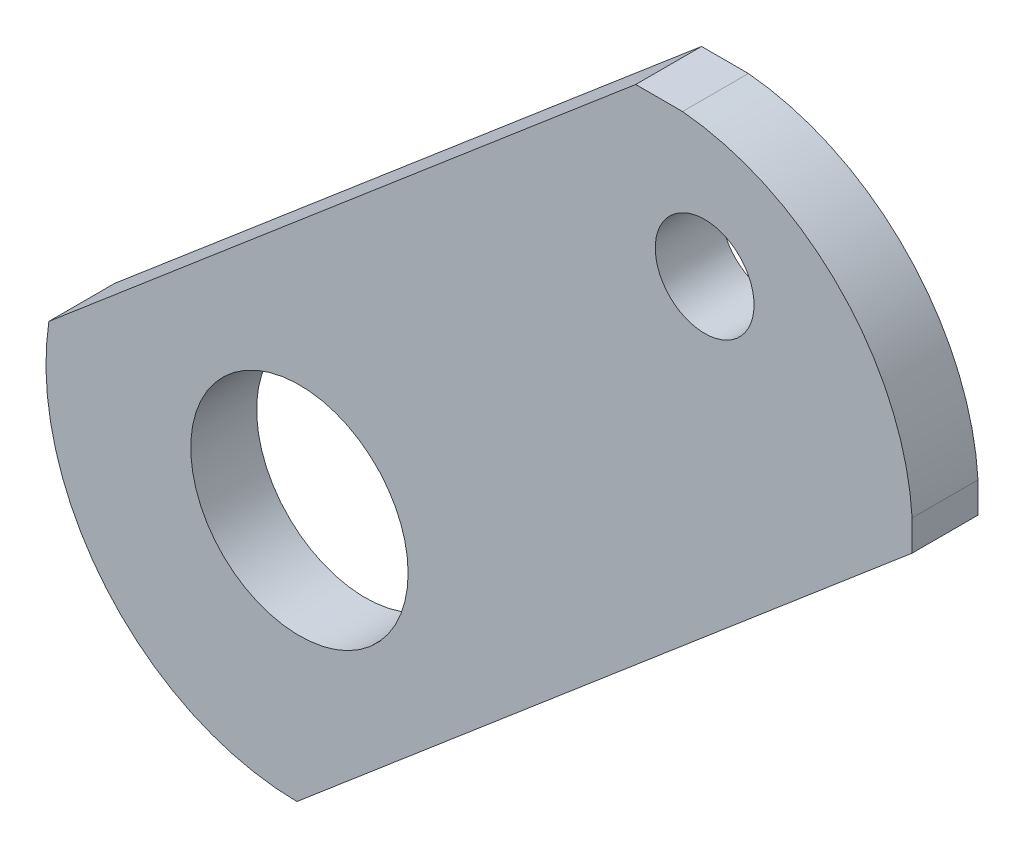
ISO-10303-21;
HEADER;
FILE_DESCRIPTION(('STEP AP214'),'2;1');
FILE_NAME('part.step','',(''),(''),'','','');
FILE_SCHEMA(('AUTOMOTIVE_DESIGN { 1 0 10303 214 1 1 1 1 }'));
ENDSEC;
DATA;
#1=APPLICATION_CONTEXT('core data for automotive mechanical design processes');
#2=APPLICATION_PROTOCOL_DEFINITION('international standard','automotive_design',2000,#1);
#3=PRODUCT_CONTEXT('',#1,'mechanical');
#4=PRODUCT('Part','Part','',(#3));
#5=PRODUCT_RELATED_PRODUCT_CATEGORY('part','',(#4));
#6=PRODUCT_DEFINITION_FORMATION('','',#4);
#7=PRODUCT_DEFINITION_CONTEXT('part definition',#1,'design');
#8=PRODUCT_DEFINITION('design','',#6,#7);
#9=PRODUCT_DEFINITION_SHAPE('','',#8);
#10=(LENGTH_UNIT() NAMED_UNIT(*) SI_UNIT(.MILLI.,.METRE.));
#11=(NAMED_UNIT(*) PLANE_ANGLE_UNIT() SI_UNIT($,.RADIAN.));
#12=(NAMED_UNIT(*) SI_UNIT($,.STERADIAN.) SOLID_ANGLE_UNIT());
#13=UNCERTAINTY_MEASURE_WITH_UNIT(LENGTH_MEASURE(1.E-05),#10,'distance_accuracy_value','');
#14=(GEOMETRIC_REPRESENTATION_CONTEXT(3) GLOBAL_UNCERTAINTY_ASSIGNED_CONTEXT((#13)) GLOBAL_UNIT_ASSIGNED_CONTEXT((#10,
#11,#12)) REPRESENTATION_CONTEXT('',''));
#15=CARTESIAN_POINT('',(0.,0.,0.));
#16=DIRECTION('',(0.,0.,1.));
#17=DIRECTION('',(1.,0.,0.));
#18=AXIS2_PLACEMENT_3D('',#15,#16,#17);
#19=CARTESIAN_POINT('',(0.,0.,2.54));
#20=DIRECTION('',(0.,0.,1.));
#21=DIRECTION('',(1.,0.,0.));
#22=AXIS2_PLACEMENT_3D('',#19,#20,#21);
#23=PLANE('',#22);
#24=CARTESIAN_POINT('',(-23.6266456506603,-20.7056456506603,2.54));
#25=DIRECTION('',(0.,0.,1.));
#26=DIRECTION('',(1.,0.,0.));
#27=AXIS2_PLACEMENT_3D('',#24,#25,#26);
#28=CIRCLE('',#27,4.191);
#29=CARTESIAN_POINT('',(-19.4356456506603,-20.7056456506603,2.54));
#30=VERTEX_POINT('',#29);
#31=EDGE_CURVE('E124',#30,#30,#28,.T.);
#32=ORIENTED_EDGE('',*,*,#31,.F.);
#33=EDGE_LOOP('',(#32));
#34=FACE_BOUND('',#33,.T.);
#35=CARTESIAN_POINT('',(-8.001,-5.08,2.54));
#36=DIRECTION('',(0.,0.,1.));
#37=DIRECTION('',(1.,0.,0.));
#38=AXIS2_PLACEMENT_3D('',#35,#36,#37);
#39=CIRCLE('',#38,1.905);
#40=CARTESIAN_POINT('',(-6.096,-5.08,2.54));
#41=VERTEX_POINT('',#40);
#42=EDGE_CURVE('E119',#41,#41,#39,.T.);
#43=ORIENTED_EDGE('',*,*,#42,.F.);
#44=EDGE_LOOP('',(#43));
#45=FACE_BOUND('',#44,.T.);
#46=CARTESIAN_POINT('',(-9.75706980936468,-9.7330161311132,2.54));
#47=DIRECTION('',(0.,0.,1.));
#48=DIRECTION('',(1.,0.,0.));
#49=AXIS2_PLACEMENT_3D('',#46,#47,#48);
#50=CIRCLE('',#49,9.77486098286725);
#51=CARTESIAN_POINT('',(-8.85357424995633,0.,2.54));
#52=VERTEX_POINT('',#51);
#53=CARTESIAN_POINT('',(0.,-9.14352824356608,2.54));
#54=VERTEX_POINT('',#53);
#55=EDGE_CURVE('E95',#52,#54,#50,.F.);
#56=ORIENTED_EDGE('',*,*,#55,.F.);
#57=DIRECTION('',(-1.,0.,0.));
#58=VECTOR('',#57,1.);
#59=CARTESIAN_POINT('',(0.,0.,2.54));
#60=LINE('',#59,#58);
#61=CARTESIAN_POINT('',(-10.6605653687731,0.,2.54));
#62=VERTEX_POINT('',#61);
#63=EDGE_CURVE('E11',#52,#62,#60,.T.);
#64=ORIENTED_EDGE('',*,*,#63,.T.);
#65=DIRECTION('',(0.762093759415718,0.647466680115369,0.));
#66=VECTOR('',#65,1.);
#67=CARTESIAN_POINT('',(-10.6605653687731,0.,2.54));
#68=LINE('',#67,#66);
#69=CARTESIAN_POINT('',(-33.2886510388991,-19.2245787676247,2.54));
#70=VERTEX_POINT('',#69);
#71=EDGE_CURVE('E152',#70,#62,#68,.T.);
#72=ORIENTED_EDGE('',*,*,#71,.F.);
#73=CARTESIAN_POINT('',(-23.6266456506603,-20.7056456506603,2.54));
#74=DIRECTION('',(0.,0.,1.));
#75=DIRECTION('',(1.,0.,0.));
#76=AXIS2_PLACEMENT_3D('',#73,#74,#75);
#77=CIRCLE('',#76,9.77486097987292);
#78=CARTESIAN_POINT('',(-23.7261659396729,-30.48,2.54));
#79=VERTEX_POINT('',#78);
#80=EDGE_CURVE('E65',#70,#79,#77,.T.);
#81=ORIENTED_EDGE('',*,*,#80,.T.);
#82=DIRECTION('',(-0.762093759415718,-0.647466680115369,0.));
#83=VECTOR('',#82,1.);
#84=CARTESIAN_POINT('',(0.,-10.3225040186603,2.54));
#85=LINE('',#84,#83);
#86=CARTESIAN_POINT('',(0.,-10.3225040186603,2.54));
#87=VERTEX_POINT('',#86);
#88=EDGE_CURVE('E141',#87,#79,#85,.T.);
#89=ORIENTED_EDGE('',*,*,#88,.F.);
#90=DIRECTION('',(0.,1.,0.));
#91=VECTOR('',#90,1.);
#92=CARTESIAN_POINT('',(0.,-30.48,2.54));
#93=LINE('',#92,#91);
#94=EDGE_CURVE('E49',#87,#54,#93,.T.);
#95=ORIENTED_EDGE('',*,*,#94,.T.);
#96=EDGE_LOOP('',(#56,#64,#72,#81,#89,#95));
#97=FACE_BOUND('',#96,.T.);
#98=ADVANCED_FACE('F39',(#34,#45,#97),#23,.T.);
#99=CARTESIAN_POINT('',(0.,0.,0.));
#100=DIRECTION('',(0.,0.,1.));
#101=DIRECTION('',(1.,0.,0.));
#102=AXIS2_PLACEMENT_3D('',#99,#100,#101);
#103=PLANE('',#102);
#104=CARTESIAN_POINT('',(-23.6266456506603,-20.7056456506603,0.));
#105=DIRECTION('',(0.,0.,1.));
#106=DIRECTION('',(1.,0.,0.));
#107=AXIS2_PLACEMENT_3D('',#104,#105,#106);
#108=CIRCLE('',#107,4.191);
#109=CARTESIAN_POINT('',(-19.4356456506603,-20.7056456506603,0.));
#110=VERTEX_POINT('',#109);
#111=EDGE_CURVE('E128',#110,#110,#108,.T.);
#112=ORIENTED_EDGE('',*,*,#111,.T.);
#113=EDGE_LOOP('',(#112));
#114=FACE_BOUND('',#113,.T.);
#115=CARTESIAN_POINT('',(-8.001,-5.08,0.));
#116=DIRECTION('',(0.,0.,1.));
#117=DIRECTION('',(1.,0.,0.));
#118=AXIS2_PLACEMENT_3D('',#115,#116,#117);
#119=CIRCLE('',#118,1.905);
#120=CARTESIAN_POINT('',(-6.096,-5.08,0.));
#121=VERTEX_POINT('',#120);
#122=EDGE_CURVE('E115',#121,#121,#119,.T.);
#123=ORIENTED_EDGE('',*,*,#122,.T.);
#124=EDGE_LOOP('',(#123));
#125=FACE_BOUND('',#124,.T.);
#126=DIRECTION('',(-1.,0.,0.));
#127=VECTOR('',#126,1.);
#128=CARTESIAN_POINT('',(0.,0.,0.));
#129=LINE('',#128,#127);
#130=CARTESIAN_POINT('',(-8.85357424995632,0.,0.));
#131=VERTEX_POINT('',#130);
#132=CARTESIAN_POINT('',(-10.6605653687731,0.,0.));
#133=VERTEX_POINT('',#132);
#134=EDGE_CURVE('E43',#131,#133,#129,.T.);
#135=ORIENTED_EDGE('',*,*,#134,.F.);
#136=CARTESIAN_POINT('',(-9.75706980936468,-9.7330161311132,0.));
#137=DIRECTION('',(0.,0.,1.));
#138=DIRECTION('',(1.,0.,0.));
#139=AXIS2_PLACEMENT_3D('',#136,#137,#138);
#140=CIRCLE('',#139,9.77486098286725);
#141=CARTESIAN_POINT('',(0.,-9.14352824356608,0.));
#142=VERTEX_POINT('',#141);
#143=EDGE_CURVE('E57',#131,#142,#140,.F.);
#144=ORIENTED_EDGE('',*,*,#143,.T.);
#145=DIRECTION('',(0.,1.,0.));
#146=VECTOR('',#145,1.);
#147=CARTESIAN_POINT('',(0.,-30.48,0.));
#148=LINE('',#147,#146);
#149=CARTESIAN_POINT('',(0.,-10.3225040186603,0.));
#150=VERTEX_POINT('',#149);
#151=EDGE_CURVE('E108',#150,#142,#148,.T.);
#152=ORIENTED_EDGE('',*,*,#151,.F.);
#153=DIRECTION('',(-0.762093759415718,-0.647466680115369,0.));
#154=VECTOR('',#153,1.);
#155=CARTESIAN_POINT('',(0.,-10.3225040186603,0.));
#156=LINE('',#155,#154);
#157=CARTESIAN_POINT('',(-23.7261659396729,-30.48,0.));
#158=VERTEX_POINT('',#157);
#159=EDGE_CURVE('E138',#150,#158,#156,.T.);
#160=ORIENTED_EDGE('',*,*,#159,.T.);
#161=CARTESIAN_POINT('',(-23.6266456506603,-20.7056456506603,0.));
#162=DIRECTION('',(0.,0.,1.));
#163=DIRECTION('',(1.,0.,0.));
#164=AXIS2_PLACEMENT_3D('',#161,#162,#163);
#165=CIRCLE('',#164,9.77486097987292);
#166=CARTESIAN_POINT('',(-33.2886510388991,-19.2245787676247,0.));
#167=VERTEX_POINT('',#166);
#168=EDGE_CURVE('E161',#167,#158,#165,.T.);
#169=ORIENTED_EDGE('',*,*,#168,.F.);
#170=DIRECTION('',(0.762093759415718,0.647466680115369,0.));
#171=VECTOR('',#170,1.);
#172=CARTESIAN_POINT('',(-10.6605653687731,0.,0.));
#173=LINE('',#172,#171);
#174=EDGE_CURVE('E151',#167,#133,#173,.T.);
#175=ORIENTED_EDGE('',*,*,#174,.T.);
#176=EDGE_LOOP('',(#135,#144,#152,#160,#169,#175));
#177=FACE_BOUND('',#176,.T.);
#178=ADVANCED_FACE('F106',(#114,#125,#177),#103,.F.);
#179=CARTESIAN_POINT('',(-10.6605653687731,0.,0.));
#180=DIRECTION('',(0.647466680115369,-0.762093759415718,0.));
#181=DIRECTION('',(0.762093759415718,0.647466680115369,0.));
#182=AXIS2_PLACEMENT_3D('',#179,#180,#181);
#183=PLANE('',#182);
#184=DIRECTION('',(0.,0.,1.));
#185=VECTOR('',#184,1.);
#186=CARTESIAN_POINT('',(-33.2886510388991,-19.2245787676247,0.));
#187=LINE('',#186,#185);
#188=EDGE_CURVE('E156',#167,#70,#187,.T.);
#189=ORIENTED_EDGE('',*,*,#188,.T.);
#190=ORIENTED_EDGE('',*,*,#71,.T.);
#191=DIRECTION('',(0.,0.,1.));
#192=VECTOR('',#191,1.);
#193=CARTESIAN_POINT('',(-10.6605653687731,0.,0.));
#194=LINE('',#193,#192);
#195=EDGE_CURVE('E145',#133,#62,#194,.T.);
#196=ORIENTED_EDGE('',*,*,#195,.F.);
#197=ORIENTED_EDGE('',*,*,#174,.F.);
#198=EDGE_LOOP('',(#189,#190,#196,#197));
#199=FACE_BOUND('',#198,.T.);
#200=ADVANCED_FACE('F178',(#199),#183,.F.);
#201=CARTESIAN_POINT('',(0.,-30.48,2.54));
#202=DIRECTION('',(-1.,0.,0.));
#203=DIRECTION('',(0.,-1.,0.));
#204=AXIS2_PLACEMENT_3D('',#201,#202,#203);
#205=PLANE('',#204);
#206=ORIENTED_EDGE('',*,*,#151,.T.);
#207=DIRECTION('',(0.,0.,1.));
#208=VECTOR('',#207,1.);
#209=CARTESIAN_POINT('',(0.,-9.14352824356608,0.));
#210=LINE('',#209,#208);
#211=EDGE_CURVE('E92',#142,#54,#210,.T.);
#212=ORIENTED_EDGE('',*,*,#211,.T.);
#213=ORIENTED_EDGE('',*,*,#94,.F.);
#214=DIRECTION('',(0.,0.,1.));
#215=VECTOR('',#214,1.);
#216=CARTESIAN_POINT('',(0.,-10.3225040186603,0.));
#217=LINE('',#216,#215);
#218=EDGE_CURVE('E113',#150,#87,#217,.T.);
#219=ORIENTED_EDGE('',*,*,#218,.F.);
#220=EDGE_LOOP('',(#206,#212,#213,#219));
#221=FACE_BOUND('',#220,.T.);
#222=ADVANCED_FACE('F41',(#221),#205,.F.);
#223=CARTESIAN_POINT('',(0.,0.,2.54));
#224=DIRECTION('',(0.,-1.,0.));
#225=DIRECTION('',(1.,0.,0.));
#226=AXIS2_PLACEMENT_3D('',#223,#224,#225);
#227=PLANE('',#226);
#228=ORIENTED_EDGE('',*,*,#63,.F.);
#229=DIRECTION('',(0.,0.,1.));
#230=VECTOR('',#229,1.);
#231=CARTESIAN_POINT('',(-8.85357424995633,0.,0.));
#232=LINE('',#231,#230);
#233=EDGE_CURVE('E101',#131,#52,#232,.T.);
#234=ORIENTED_EDGE('',*,*,#233,.F.);
#235=ORIENTED_EDGE('',*,*,#134,.T.);
#236=ORIENTED_EDGE('',*,*,#195,.T.);
#237=EDGE_LOOP('',(#228,#234,#235,#236));
#238=FACE_BOUND('',#237,.T.);
#239=ADVANCED_FACE('F174',(#238),#227,.F.);
#240=CARTESIAN_POINT('',(-23.6266456506603,-20.7056456506603,0.));
#241=DIRECTION('',(0.,0.,1.));
#242=DIRECTION('',(1.,0.,0.));
#243=AXIS2_PLACEMENT_3D('',#240,#241,#242);
#244=CYLINDRICAL_SURFACE('',#243,4.191);
#245=ORIENTED_EDGE('',*,*,#111,.F.);
#246=EDGE_LOOP('',(#245));
#247=FACE_BOUND('',#246,.T.);
#248=ORIENTED_EDGE('',*,*,#31,.T.);
#249=EDGE_LOOP('',(#248));
#250=FACE_BOUND('',#249,.T.);
#251=ADVANCED_FACE('F205',(#247,#250),#244,.F.);
#252=CARTESIAN_POINT('',(-8.001,-5.08,0.));
#253=DIRECTION('',(0.,0.,1.));
#254=DIRECTION('',(1.,0.,0.));
#255=AXIS2_PLACEMENT_3D('',#252,#253,#254);
#256=CYLINDRICAL_SURFACE('',#255,1.905);
#257=ORIENTED_EDGE('',*,*,#122,.F.);
#258=EDGE_LOOP('',(#257));
#259=FACE_BOUND('',#258,.T.);
#260=ORIENTED_EDGE('',*,*,#42,.T.);
#261=EDGE_LOOP('',(#260));
#262=FACE_BOUND('',#261,.T.);
#263=ADVANCED_FACE('F191',(#259,#262),#256,.F.);
#264=CARTESIAN_POINT('',(0.,-10.3225040186603,0.));
#265=DIRECTION('',(-0.647466680115369,0.762093759415718,0.));
#266=DIRECTION('',(-0.762093759415718,-0.647466680115369,0.));
#267=AXIS2_PLACEMENT_3D('',#264,#265,#266);
#268=PLANE('',#267);
#269=ORIENTED_EDGE('',*,*,#88,.T.);
#270=DIRECTION('',(0.,0.,1.));
#271=VECTOR('',#270,1.);
#272=CARTESIAN_POINT('',(-23.7261659396729,-30.48,0.));
#273=LINE('',#272,#271);
#274=EDGE_CURVE('E129',#158,#79,#273,.T.);
#275=ORIENTED_EDGE('',*,*,#274,.F.);
#276=ORIENTED_EDGE('',*,*,#159,.F.);
#277=ORIENTED_EDGE('',*,*,#218,.T.);
#278=EDGE_LOOP('',(#269,#275,#276,#277));
#279=FACE_BOUND('',#278,.T.);
#280=ADVANCED_FACE('F181',(#279),#268,.F.);
#281=CARTESIAN_POINT('',(-23.6266456506603,-20.7056456506603,0.));
#282=DIRECTION('',(0.,0.,1.));
#283=DIRECTION('',(1.,0.,0.));
#284=AXIS2_PLACEMENT_3D('',#281,#282,#283);
#285=CYLINDRICAL_SURFACE('',#284,9.77486097987292);
#286=ORIENTED_EDGE('',*,*,#80,.F.);
#287=ORIENTED_EDGE('',*,*,#188,.F.);
#288=ORIENTED_EDGE('',*,*,#168,.T.);
#289=ORIENTED_EDGE('',*,*,#274,.T.);
#290=EDGE_LOOP('',(#286,#287,#288,#289));
#291=FACE_BOUND('',#290,.T.);
#292=ADVANCED_FACE('F183',(#291),#285,.T.);
#293=CARTESIAN_POINT('',(-9.75706980936468,-9.7330161311132,0.));
#294=DIRECTION('',(0.,0.,1.));
#295=DIRECTION('',(1.,0.,0.));
#296=AXIS2_PLACEMENT_3D('',#293,#294,#295);
#297=CYLINDRICAL_SURFACE('',#296,9.77486098286725);
#298=ORIENTED_EDGE('',*,*,#55,.T.);
#299=ORIENTED_EDGE('',*,*,#211,.F.);
#300=ORIENTED_EDGE('',*,*,#143,.F.);
#301=ORIENTED_EDGE('',*,*,#233,.T.);
#302=EDGE_LOOP('',(#298,#299,#300,#301));
#303=FACE_BOUND('',#302,.T.);
#304=ADVANCED_FACE('F93',(#303),#297,.T.);
#305=CLOSED_SHELL('',(#98,#178,#200,#222,#239,#251,#263,#280,#292,#304));
#306=MANIFOLD_SOLID_BREP('B2',#305);
#307=ADVANCED_BREP_SHAPE_REPRESENTATION('',(#18,#306),#14);
#308=SHAPE_DEFINITION_REPRESENTATION(#9,#307);
ENDSEC;
END-ISO-10303-21;
